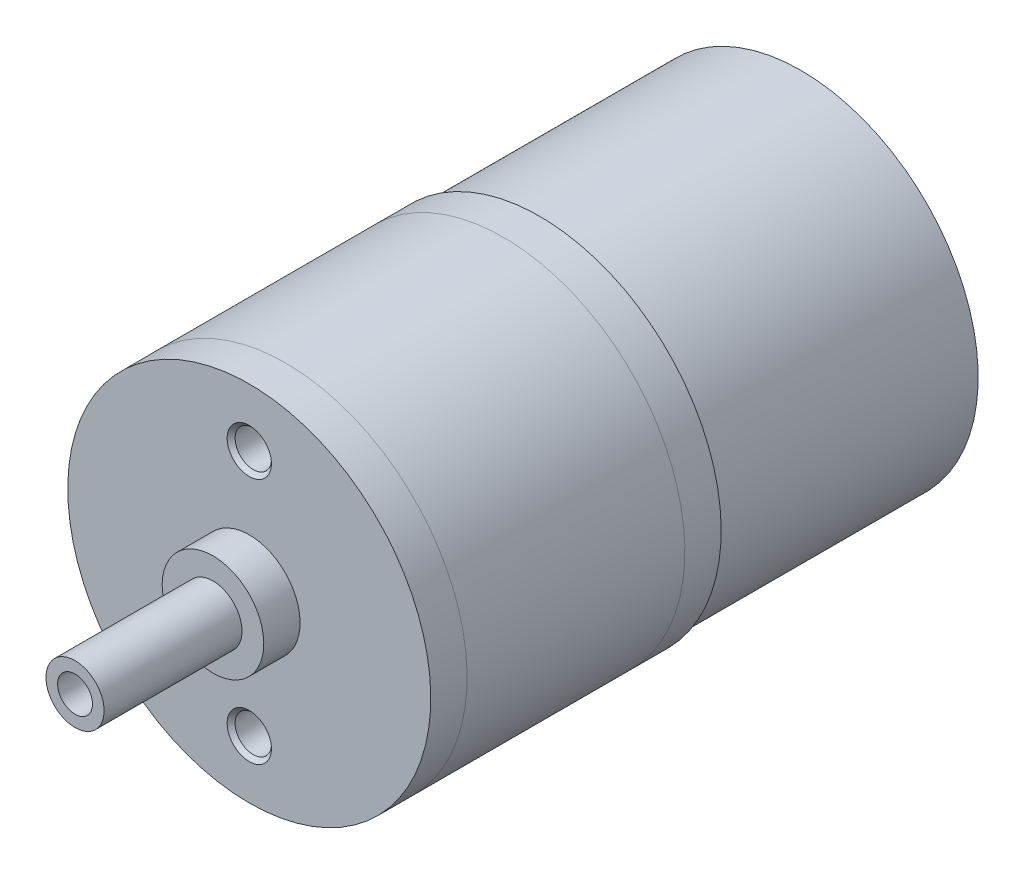
ISO-10303-21;
HEADER;
FILE_DESCRIPTION(('STEP AP214'),'2;1');
FILE_NAME('part.step','',(''),(''),'','','');
FILE_SCHEMA(('AUTOMOTIVE_DESIGN { 1 0 10303 214 1 1 1 1 }'));
ENDSEC;
DATA;
#1=APPLICATION_CONTEXT('core data for automotive mechanical design processes');
#2=APPLICATION_PROTOCOL_DEFINITION('international standard','automotive_design',2000,#1);
#3=PRODUCT_CONTEXT('',#1,'mechanical');
#4=PRODUCT('Part','Part','',(#3));
#5=PRODUCT_RELATED_PRODUCT_CATEGORY('part','',(#4));
#6=PRODUCT_DEFINITION_FORMATION('','',#4);
#7=PRODUCT_DEFINITION_CONTEXT('part definition',#1,'design');
#8=PRODUCT_DEFINITION('design','',#6,#7);
#9=PRODUCT_DEFINITION_SHAPE('','',#8);
#10=(LENGTH_UNIT() NAMED_UNIT(*) SI_UNIT(.MILLI.,.METRE.));
#11=(NAMED_UNIT(*) PLANE_ANGLE_UNIT() SI_UNIT($,.RADIAN.));
#12=(NAMED_UNIT(*) SI_UNIT($,.STERADIAN.) SOLID_ANGLE_UNIT());
#13=UNCERTAINTY_MEASURE_WITH_UNIT(LENGTH_MEASURE(1.E-05),#10,'distance_accuracy_value','');
#14=(GEOMETRIC_REPRESENTATION_CONTEXT(3) GLOBAL_UNCERTAINTY_ASSIGNED_CONTEXT((#13)) GLOBAL_UNIT_ASSIGNED_CONTEXT((#10,
#11,#12)) REPRESENTATION_CONTEXT('',''));
#15=CARTESIAN_POINT('',(0.,0.,0.));
#16=DIRECTION('',(0.,0.,1.));
#17=DIRECTION('',(1.,0.,0.));
#18=AXIS2_PLACEMENT_3D('',#15,#16,#17);
#19=CARTESIAN_POINT('',(0.,0.,0.));
#20=DIRECTION('',(0.,0.,1.));
#21=DIRECTION('',(0.,-1.,0.));
#22=AXIS2_PLACEMENT_3D('',#19,#20,#21);
#23=CYLINDRICAL_SURFACE('',#22,12.5);
#24=CARTESIAN_POINT('',(0.,0.,20.));
#25=DIRECTION('',(0.,0.,1.));
#26=DIRECTION('',(0.,-1.,0.));
#27=AXIS2_PLACEMENT_3D('',#24,#25,#26);
#28=CIRCLE('',#27,12.5);
#29=CARTESIAN_POINT('',(0.,-12.5,20.));
#30=VERTEX_POINT('',#29);
#31=EDGE_CURVE('E103',#30,#30,#28,.T.);
#32=ORIENTED_EDGE('',*,*,#31,.F.);
#33=EDGE_LOOP('',(#32));
#34=FACE_BOUND('',#33,.T.);
#35=CARTESIAN_POINT('',(0.,0.,17.5));
#36=DIRECTION('',(0.,0.,-1.));
#37=DIRECTION('',(-1.,0.,0.));
#38=AXIS2_PLACEMENT_3D('',#35,#36,#37);
#39=CIRCLE('',#38,12.5);
#40=CARTESIAN_POINT('',(-12.5,0.,17.5));
#41=VERTEX_POINT('',#40);
#42=EDGE_CURVE('E125',#41,#41,#39,.T.);
#43=ORIENTED_EDGE('',*,*,#42,.F.);
#44=EDGE_LOOP('',(#43));
#45=FACE_BOUND('',#44,.T.);
#46=ADVANCED_FACE('F48',(#34,#45),#23,.T.);
#47=ORIENTED_EDGE('',*,*,#42,.T.);
#48=EDGE_LOOP('',(#47));
#49=FACE_BOUND('',#48,.T.);
#50=CARTESIAN_POINT('',(0.,0.,2.5));
#51=DIRECTION('',(0.,0.,-1.));
#52=DIRECTION('',(-1.,0.,0.));
#53=AXIS2_PLACEMENT_3D('',#50,#51,#52);
#54=CIRCLE('',#53,12.5);
#55=CARTESIAN_POINT('',(-12.5,0.,2.5));
#56=VERTEX_POINT('',#55);
#57=EDGE_CURVE('E121',#56,#56,#54,.T.);
#58=ORIENTED_EDGE('',*,*,#57,.F.);
#59=EDGE_LOOP('',(#58));
#60=FACE_BOUND('',#59,.T.);
#61=ADVANCED_FACE('F143',(#49,#60),#23,.T.);
#62=CARTESIAN_POINT('',(0.,0.,-20.));
#63=DIRECTION('',(0.,0.,1.));
#64=DIRECTION('',(0.,-1.,0.));
#65=AXIS2_PLACEMENT_3D('',#62,#63,#64);
#66=PLANE('',#65);
#67=CARTESIAN_POINT('',(0.,0.,-20.));
#68=DIRECTION('',(0.,0.,1.));
#69=DIRECTION('',(0.,-1.,0.));
#70=AXIS2_PLACEMENT_3D('',#67,#68,#69);
#71=CIRCLE('',#70,3.5);
#72=CARTESIAN_POINT('',(0.,-3.5,-20.));
#73=VERTEX_POINT('',#72);
#74=EDGE_CURVE('E118',#73,#73,#71,.T.);
#75=ORIENTED_EDGE('',*,*,#74,.F.);
#76=EDGE_LOOP('',(#75));
#77=FACE_BOUND('',#76,.T.);
#78=ADVANCED_FACE('F150',(#77),#66,.F.);
#79=CARTESIAN_POINT('',(0.,0.,0.));
#80=DIRECTION('',(0.,0.,1.));
#81=DIRECTION('',(0.,-1.,0.));
#82=AXIS2_PLACEMENT_3D('',#79,#80,#81);
#83=CYLINDRICAL_SURFACE('',#82,3.5);
#84=CARTESIAN_POINT('',(0.,0.,-18.));
#85=DIRECTION('',(0.,0.,1.));
#86=DIRECTION('',(0.,-1.,0.));
#87=AXIS2_PLACEMENT_3D('',#84,#85,#86);
#88=CIRCLE('',#87,3.5);
#89=CARTESIAN_POINT('',(0.,-3.5,-18.));
#90=VERTEX_POINT('',#89);
#91=EDGE_CURVE('E115',#90,#90,#88,.T.);
#92=ORIENTED_EDGE('',*,*,#91,.F.);
#93=EDGE_LOOP('',(#92));
#94=FACE_BOUND('',#93,.T.);
#95=ORIENTED_EDGE('',*,*,#74,.T.);
#96=EDGE_LOOP('',(#95));
#97=FACE_BOUND('',#96,.T.);
#98=ADVANCED_FACE('F182',(#94,#97),#83,.T.);
#99=CARTESIAN_POINT('',(0.,3.5,-18.));
#100=DIRECTION('',(0.,0.,1.));
#101=DIRECTION('',(0.,-1.,0.));
#102=AXIS2_PLACEMENT_3D('',#99,#100,#101);
#103=PLANE('',#102);
#104=CARTESIAN_POINT('',(0.,0.,-18.));
#105=DIRECTION('',(0.,0.,1.));
#106=DIRECTION('',(0.,-1.,0.));
#107=AXIS2_PLACEMENT_3D('',#104,#105,#106);
#108=CIRCLE('',#107,12.2);
#109=CARTESIAN_POINT('',(0.,-12.2,-18.));
#110=VERTEX_POINT('',#109);
#111=EDGE_CURVE('E112',#110,#110,#108,.T.);
#112=ORIENTED_EDGE('',*,*,#111,.F.);
#113=EDGE_LOOP('',(#112));
#114=FACE_BOUND('',#113,.T.);
#115=ORIENTED_EDGE('',*,*,#91,.T.);
#116=EDGE_LOOP('',(#115));
#117=FACE_BOUND('',#116,.T.);
#118=ADVANCED_FACE('F176',(#114,#117),#103,.F.);
#119=CARTESIAN_POINT('',(0.,0.,0.));
#120=DIRECTION('',(0.,0.,1.));
#121=DIRECTION('',(0.,-1.,0.));
#122=AXIS2_PLACEMENT_3D('',#119,#120,#121);
#123=CYLINDRICAL_SURFACE('',#122,12.2);
#124=CARTESIAN_POINT('',(0.,0.,0.));
#125=DIRECTION('',(0.,0.,1.));
#126=DIRECTION('',(0.,-1.,0.));
#127=AXIS2_PLACEMENT_3D('',#124,#125,#126);
#128=CIRCLE('',#127,12.2);
#129=CARTESIAN_POINT('',(0.,-12.2,0.));
#130=VERTEX_POINT('',#129);
#131=EDGE_CURVE('E109',#130,#130,#128,.T.);
#132=ORIENTED_EDGE('',*,*,#131,.F.);
#133=EDGE_LOOP('',(#132));
#134=FACE_BOUND('',#133,.T.);
#135=ORIENTED_EDGE('',*,*,#111,.T.);
#136=EDGE_LOOP('',(#135));
#137=FACE_BOUND('',#136,.T.);
#138=ADVANCED_FACE('F166',(#134,#137),#123,.T.);
#139=CARTESIAN_POINT('',(0.,12.2,0.));
#140=DIRECTION('',(0.,0.,1.));
#141=DIRECTION('',(0.,-1.,0.));
#142=AXIS2_PLACEMENT_3D('',#139,#140,#141);
#143=PLANE('',#142);
#144=CARTESIAN_POINT('',(0.,0.,0.));
#145=DIRECTION('',(0.,0.,1.));
#146=DIRECTION('',(0.,-1.,0.));
#147=AXIS2_PLACEMENT_3D('',#144,#145,#146);
#148=CIRCLE('',#147,12.5);
#149=CARTESIAN_POINT('',(0.,-12.5,0.));
#150=VERTEX_POINT('',#149);
#151=EDGE_CURVE('E106',#150,#150,#148,.T.);
#152=ORIENTED_EDGE('',*,*,#151,.F.);
#153=EDGE_LOOP('',(#152));
#154=FACE_BOUND('',#153,.T.);
#155=ORIENTED_EDGE('',*,*,#131,.T.);
#156=EDGE_LOOP('',(#155));
#157=FACE_BOUND('',#156,.T.);
#158=ADVANCED_FACE('F158',(#154,#157),#143,.F.);
#159=ORIENTED_EDGE('',*,*,#57,.T.);
#160=EDGE_LOOP('',(#159));
#161=FACE_BOUND('',#160,.T.);
#162=ORIENTED_EDGE('',*,*,#151,.T.);
#163=EDGE_LOOP('',(#162));
#164=FACE_BOUND('',#163,.T.);
#165=ADVANCED_FACE('F146',(#161,#164),#23,.T.);
#166=CARTESIAN_POINT('',(0.,12.5,20.));
#167=DIRECTION('',(0.,0.,-1.));
#168=DIRECTION('',(0.,1.,0.));
#169=AXIS2_PLACEMENT_3D('',#166,#167,#168);
#170=PLANE('',#169);
#171=CARTESIAN_POINT('',(0.,8.5,20.));
#172=DIRECTION('',(0.,0.,1.));
#173=DIRECTION('',(1.,0.,0.));
#174=AXIS2_PLACEMENT_3D('',#171,#172,#173);
#175=CIRCLE('',#174,1.525);
#176=CARTESIAN_POINT('',(1.525,8.5,20.));
#177=VERTEX_POINT('',#176);
#178=EDGE_CURVE('E79',#177,#177,#175,.T.);
#179=ORIENTED_EDGE('',*,*,#178,.F.);
#180=EDGE_LOOP('',(#179));
#181=FACE_BOUND('',#180,.T.);
#182=CARTESIAN_POINT('',(0.,-8.5,20.));
#183=DIRECTION('',(0.,0.,1.));
#184=DIRECTION('',(1.,0.,0.));
#185=AXIS2_PLACEMENT_3D('',#182,#183,#184);
#186=CIRCLE('',#185,1.525);
#187=CARTESIAN_POINT('',(1.525,-8.5,20.));
#188=VERTEX_POINT('',#187);
#189=EDGE_CURVE('E72',#188,#188,#186,.T.);
#190=ORIENTED_EDGE('',*,*,#189,.F.);
#191=EDGE_LOOP('',(#190));
#192=FACE_BOUND('',#191,.T.);
#193=CARTESIAN_POINT('',(0.,0.,20.));
#194=DIRECTION('',(0.,0.,1.));
#195=DIRECTION('',(0.,-1.,0.));
#196=AXIS2_PLACEMENT_3D('',#193,#194,#195);
#197=CIRCLE('',#196,3.5);
#198=CARTESIAN_POINT('',(0.,-3.5,20.));
#199=VERTEX_POINT('',#198);
#200=EDGE_CURVE('E100',#199,#199,#197,.T.);
#201=ORIENTED_EDGE('',*,*,#200,.F.);
#202=EDGE_LOOP('',(#201));
#203=FACE_BOUND('',#202,.T.);
#204=ORIENTED_EDGE('',*,*,#31,.T.);
#205=EDGE_LOOP('',(#204));
#206=FACE_BOUND('',#205,.T.);
#207=ADVANCED_FACE('F157',(#181,#192,#203,#206),#170,.F.);
#208=CARTESIAN_POINT('',(0.,0.,0.));
#209=DIRECTION('',(0.,0.,1.));
#210=DIRECTION('',(0.,-1.,0.));
#211=AXIS2_PLACEMENT_3D('',#208,#209,#210);
#212=CYLINDRICAL_SURFACE('',#211,3.5);
#213=CARTESIAN_POINT('',(0.,0.,22.5));
#214=DIRECTION('',(0.,0.,1.));
#215=DIRECTION('',(0.,-1.,0.));
#216=AXIS2_PLACEMENT_3D('',#213,#214,#215);
#217=CIRCLE('',#216,3.5);
#218=CARTESIAN_POINT('',(0.,-3.5,22.5));
#219=VERTEX_POINT('',#218);
#220=EDGE_CURVE('E97',#219,#219,#217,.T.);
#221=ORIENTED_EDGE('',*,*,#220,.F.);
#222=EDGE_LOOP('',(#221));
#223=FACE_BOUND('',#222,.T.);
#224=ORIENTED_EDGE('',*,*,#200,.T.);
#225=EDGE_LOOP('',(#224));
#226=FACE_BOUND('',#225,.T.);
#227=ADVANCED_FACE('F164',(#223,#226),#212,.T.);
#228=CARTESIAN_POINT('',(0.,3.5,22.5));
#229=DIRECTION('',(0.,0.,-1.));
#230=DIRECTION('',(0.,1.,0.));
#231=AXIS2_PLACEMENT_3D('',#228,#229,#230);
#232=PLANE('',#231);
#233=CARTESIAN_POINT('',(0.,0.,22.5));
#234=DIRECTION('',(0.,0.,1.));
#235=DIRECTION('',(0.,-1.,0.));
#236=AXIS2_PLACEMENT_3D('',#233,#234,#235);
#237=CIRCLE('',#236,2.);
#238=CARTESIAN_POINT('',(0.,-2.,22.5));
#239=VERTEX_POINT('',#238);
#240=EDGE_CURVE('E94',#239,#239,#237,.T.);
#241=ORIENTED_EDGE('',*,*,#240,.F.);
#242=EDGE_LOOP('',(#241));
#243=FACE_BOUND('',#242,.T.);
#244=ORIENTED_EDGE('',*,*,#220,.T.);
#245=EDGE_LOOP('',(#244));
#246=FACE_BOUND('',#245,.T.);
#247=ADVANCED_FACE('F222',(#243,#246),#232,.F.);
#248=CARTESIAN_POINT('',(0.,0.,0.));
#249=DIRECTION('',(0.,0.,1.));
#250=DIRECTION('',(0.,-1.,0.));
#251=AXIS2_PLACEMENT_3D('',#248,#249,#250);
#252=CYLINDRICAL_SURFACE('',#251,2.);
#253=CARTESIAN_POINT('',(0.,0.,32.));
#254=DIRECTION('',(0.,0.,1.));
#255=DIRECTION('',(0.,-1.,0.));
#256=AXIS2_PLACEMENT_3D('',#253,#254,#255);
#257=CIRCLE('',#256,2.);
#258=CARTESIAN_POINT('',(0.,-2.,32.));
#259=VERTEX_POINT('',#258);
#260=EDGE_CURVE('E91',#259,#259,#257,.T.);
#261=ORIENTED_EDGE('',*,*,#260,.F.);
#262=EDGE_LOOP('',(#261));
#263=FACE_BOUND('',#262,.T.);
#264=ORIENTED_EDGE('',*,*,#240,.T.);
#265=EDGE_LOOP('',(#264));
#266=FACE_BOUND('',#265,.T.);
#267=ADVANCED_FACE('F232',(#263,#266),#252,.T.);
#268=CARTESIAN_POINT('',(0.,2.,32.));
#269=DIRECTION('',(0.,0.,-1.));
#270=DIRECTION('',(0.,1.,0.));
#271=AXIS2_PLACEMENT_3D('',#268,#269,#270);
#272=PLANE('',#271);
#273=CARTESIAN_POINT('',(0.,0.,32.));
#274=DIRECTION('',(0.,0.,1.));
#275=DIRECTION('',(0.,-1.,0.));
#276=AXIS2_PLACEMENT_3D('',#273,#274,#275);
#277=CIRCLE('',#276,1.2);
#278=CARTESIAN_POINT('',(0.,-1.2,32.));
#279=VERTEX_POINT('',#278);
#280=EDGE_CURVE('E88',#279,#279,#277,.T.);
#281=ORIENTED_EDGE('',*,*,#280,.F.);
#282=EDGE_LOOP('',(#281));
#283=FACE_BOUND('',#282,.T.);
#284=ORIENTED_EDGE('',*,*,#260,.T.);
#285=EDGE_LOOP('',(#284));
#286=FACE_BOUND('',#285,.T.);
#287=ADVANCED_FACE('F242',(#283,#286),#272,.F.);
#288=CARTESIAN_POINT('',(0.,0.,0.));
#289=DIRECTION('',(0.,0.,1.));
#290=DIRECTION('',(0.,-1.,0.));
#291=AXIS2_PLACEMENT_3D('',#288,#289,#290);
#292=CYLINDRICAL_SURFACE('',#291,1.2);
#293=CARTESIAN_POINT('',(0.,0.,25.));
#294=DIRECTION('',(0.,0.,-1.));
#295=DIRECTION('',(0.,1.,0.));
#296=AXIS2_PLACEMENT_3D('',#293,#294,#295);
#297=CIRCLE('',#296,1.2);
#298=CARTESIAN_POINT('',(0.,1.2,25.));
#299=VERTEX_POINT('',#298);
#300=EDGE_CURVE('E11',#299,#299,#297,.T.);
#301=ORIENTED_EDGE('',*,*,#300,.T.);
#302=EDGE_LOOP('',(#301));
#303=FACE_BOUND('',#302,.T.);
#304=ORIENTED_EDGE('',*,*,#280,.T.);
#305=EDGE_LOOP('',(#304));
#306=FACE_BOUND('',#305,.T.);
#307=ADVANCED_FACE('F251',(#303,#306),#292,.F.);
#308=CARTESIAN_POINT('',(0.,1.2,24.));
#309=DIRECTION('',(0.,0.,-1.));
#310=DIRECTION('',(0.,1.,0.));
#311=AXIS2_PLACEMENT_3D('',#308,#309,#310);
#312=PLANE('',#311);
#313=CARTESIAN_POINT('',(0.,0.,24.));
#314=DIRECTION('',(0.,0.,-1.));
#315=DIRECTION('',(0.,1.,0.));
#316=AXIS2_PLACEMENT_3D('',#313,#314,#315);
#317=CIRCLE('',#316,0.2);
#318=CARTESIAN_POINT('',(0.,0.2,24.));
#319=VERTEX_POINT('',#318);
#320=EDGE_CURVE('E56',#319,#319,#317,.F.);
#321=ORIENTED_EDGE('',*,*,#320,.T.);
#322=EDGE_LOOP('',(#321));
#323=FACE_BOUND('',#322,.T.);
#324=ADVANCED_FACE('F131',(#323),#312,.F.);
#325=CARTESIAN_POINT('',(0.,-8.5,13.7510757737845));
#326=DIRECTION('',(0.,0.,1.));
#327=DIRECTION('',(1.,0.,0.));
#328=AXIS2_PLACEMENT_3D('',#325,#326,#327);
#329=CONICAL_SURFACE('',#328,1.25,1.02974425867665);
#330=CARTESIAN_POINT('',(0.,-8.5,13.));
#331=VERTEX_POINT('',#330);
#332=VERTEX_LOOP('',#331);
#333=FACE_BOUND('',#332,.T.);
#334=CARTESIAN_POINT('',(0.,-8.5,13.7510757737845));
#335=DIRECTION('',(0.,0.,1.));
#336=DIRECTION('',(1.,0.,0.));
#337=AXIS2_PLACEMENT_3D('',#334,#335,#336);
#338=CIRCLE('',#337,1.25);
#339=CARTESIAN_POINT('',(1.25,-8.5,13.7510757737845));
#340=VERTEX_POINT('',#339);
#341=EDGE_CURVE('E85',#340,#340,#338,.T.);
#342=ORIENTED_EDGE('',*,*,#341,.T.);
#343=EDGE_LOOP('',(#342));
#344=FACE_BOUND('',#343,.T.);
#345=ADVANCED_FACE('F285',(#333,#344),#329,.F.);
#346=CARTESIAN_POINT('',(0.,-8.5,20.));
#347=DIRECTION('',(0.,0.,1.));
#348=DIRECTION('',(1.,0.,0.));
#349=AXIS2_PLACEMENT_3D('',#346,#347,#348);
#350=CYLINDRICAL_SURFACE('',#349,1.25);
#351=ORIENTED_EDGE('',*,*,#341,.F.);
#352=EDGE_LOOP('',(#351));
#353=FACE_BOUND('',#352,.T.);
#354=CARTESIAN_POINT('',(0.,-8.5,19.725));
#355=DIRECTION('',(0.,0.,1.));
#356=DIRECTION('',(1.,0.,0.));
#357=AXIS2_PLACEMENT_3D('',#354,#355,#356);
#358=CIRCLE('',#357,1.25);
#359=CARTESIAN_POINT('',(1.25,-8.5,19.725));
#360=VERTEX_POINT('',#359);
#361=EDGE_CURVE('E76',#360,#360,#358,.T.);
#362=ORIENTED_EDGE('',*,*,#361,.T.);
#363=EDGE_LOOP('',(#362));
#364=FACE_BOUND('',#363,.T.);
#365=ADVANCED_FACE('F289',(#353,#364),#350,.F.);
#366=CARTESIAN_POINT('',(0.,-8.5,20.));
#367=DIRECTION('',(0.,0.,1.));
#368=DIRECTION('',(1.,0.,0.));
#369=AXIS2_PLACEMENT_3D('',#366,#367,#368);
#370=CONICAL_SURFACE('',#369,1.525,0.785398163397442);
#371=ORIENTED_EDGE('',*,*,#361,.F.);
#372=EDGE_LOOP('',(#371));
#373=FACE_BOUND('',#372,.T.);
#374=ORIENTED_EDGE('',*,*,#189,.T.);
#375=EDGE_LOOP('',(#374));
#376=FACE_BOUND('',#375,.T.);
#377=ADVANCED_FACE('F66',(#373,#376),#370,.F.);
#378=CARTESIAN_POINT('',(0.,8.5,13.7510757737845));
#379=DIRECTION('',(0.,0.,1.));
#380=DIRECTION('',(1.,0.,0.));
#381=AXIS2_PLACEMENT_3D('',#378,#379,#380);
#382=CONICAL_SURFACE('',#381,1.25,1.02974425867665);
#383=CARTESIAN_POINT('',(0.,8.5,13.));
#384=VERTEX_POINT('',#383);
#385=VERTEX_LOOP('',#384);
#386=FACE_BOUND('',#385,.T.);
#387=CARTESIAN_POINT('',(0.,8.5,13.7510757737845));
#388=DIRECTION('',(0.,0.,1.));
#389=DIRECTION('',(1.,0.,0.));
#390=AXIS2_PLACEMENT_3D('',#387,#388,#389);
#391=CIRCLE('',#390,1.25);
#392=CARTESIAN_POINT('',(1.25,8.5,13.7510757737845));
#393=VERTEX_POINT('',#392);
#394=EDGE_CURVE('E70',#393,#393,#391,.T.);
#395=ORIENTED_EDGE('',*,*,#394,.T.);
#396=EDGE_LOOP('',(#395));
#397=FACE_BOUND('',#396,.T.);
#398=ADVANCED_FACE('F62',(#386,#397),#382,.F.);
#399=CARTESIAN_POINT('',(0.,8.5,20.));
#400=DIRECTION('',(0.,0.,1.));
#401=DIRECTION('',(1.,0.,0.));
#402=AXIS2_PLACEMENT_3D('',#399,#400,#401);
#403=CYLINDRICAL_SURFACE('',#402,1.25);
#404=ORIENTED_EDGE('',*,*,#394,.F.);
#405=EDGE_LOOP('',(#404));
#406=FACE_BOUND('',#405,.T.);
#407=CARTESIAN_POINT('',(0.,8.5,19.725));
#408=DIRECTION('',(0.,0.,1.));
#409=DIRECTION('',(1.,0.,0.));
#410=AXIS2_PLACEMENT_3D('',#407,#408,#409);
#411=CIRCLE('',#410,1.25);
#412=CARTESIAN_POINT('',(1.25,8.5,19.725));
#413=VERTEX_POINT('',#412);
#414=EDGE_CURVE('E73',#413,#413,#411,.T.);
#415=ORIENTED_EDGE('',*,*,#414,.T.);
#416=EDGE_LOOP('',(#415));
#417=FACE_BOUND('',#416,.T.);
#418=ADVANCED_FACE('F65',(#406,#417),#403,.F.);
#419=CARTESIAN_POINT('',(0.,8.5,20.));
#420=DIRECTION('',(0.,0.,1.));
#421=DIRECTION('',(1.,0.,0.));
#422=AXIS2_PLACEMENT_3D('',#419,#420,#421);
#423=CONICAL_SURFACE('',#422,1.525,0.785398163397442);
#424=ORIENTED_EDGE('',*,*,#414,.F.);
#425=EDGE_LOOP('',(#424));
#426=FACE_BOUND('',#425,.T.);
#427=ORIENTED_EDGE('',*,*,#178,.T.);
#428=EDGE_LOOP('',(#427));
#429=FACE_BOUND('',#428,.T.);
#430=ADVANCED_FACE('F134',(#426,#429),#423,.F.);
#431=CARTESIAN_POINT('',(0.,0.,25.));
#432=DIRECTION('',(0.,0.,-1.));
#433=DIRECTION('',(0.,1.,0.));
#434=AXIS2_PLACEMENT_3D('',#431,#432,#433);
#435=DEGENERATE_TOROIDAL_SURFACE('',#434,0.2,1.,.T.);
#436=ORIENTED_EDGE('',*,*,#300,.F.);
#437=EDGE_LOOP('',(#436));
#438=FACE_BOUND('',#437,.T.);
#439=ORIENTED_EDGE('',*,*,#320,.F.);
#440=EDGE_LOOP('',(#439));
#441=FACE_BOUND('',#440,.T.);
#442=ADVANCED_FACE('F50',(#438,#441),#435,.F.);
#443=CLOSED_SHELL('',(#46,#61,#78,#98,#118,#138,#158,#165,#207,#227,#247,#267,#287,#307,#324,
#345,#365,#377,#398,#418,#430,#442));
#444=MANIFOLD_SOLID_BREP('B2',#443);
#445=ADVANCED_BREP_SHAPE_REPRESENTATION('',(#18,#444),#14);
#446=SHAPE_DEFINITION_REPRESENTATION(#9,#445);
ENDSEC;
END-ISO-10303-21;
